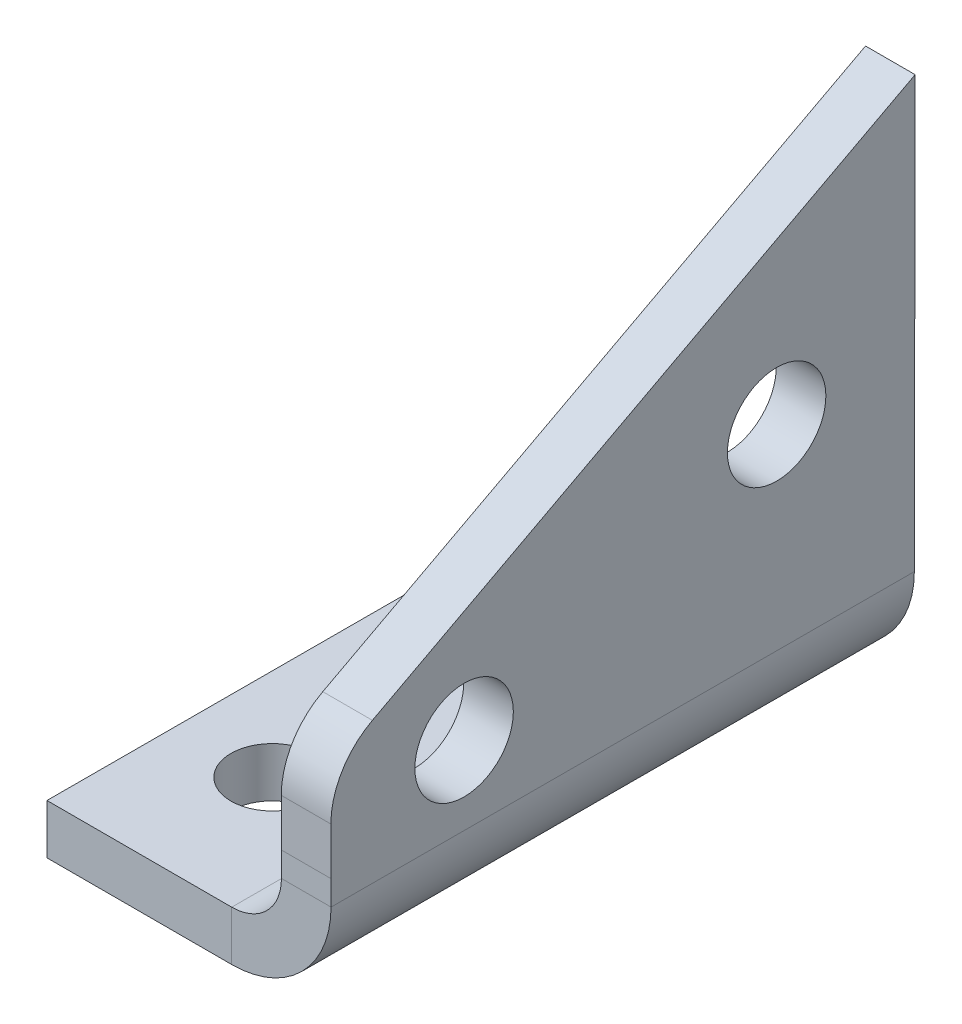
ISO-10303-21;
HEADER;
FILE_DESCRIPTION(('STEP AP214'),'2;1');
FILE_NAME('part.step','',(''),(''),'','','');
FILE_SCHEMA(('AUTOMOTIVE_DESIGN { 1 0 10303 214 1 1 1 1 }'));
ENDSEC;
DATA;
#1=APPLICATION_CONTEXT('core data for automotive mechanical design processes');
#2=APPLICATION_PROTOCOL_DEFINITION('international standard','automotive_design',2000,#1);
#3=PRODUCT_CONTEXT('',#1,'mechanical');
#4=PRODUCT('Part','Part','',(#3));
#5=PRODUCT_RELATED_PRODUCT_CATEGORY('part','',(#4));
#6=PRODUCT_DEFINITION_FORMATION('','',#4);
#7=PRODUCT_DEFINITION_CONTEXT('part definition',#1,'design');
#8=PRODUCT_DEFINITION('design','',#6,#7);
#9=PRODUCT_DEFINITION_SHAPE('','',#8);
#10=(LENGTH_UNIT() NAMED_UNIT(*) SI_UNIT(.MILLI.,.METRE.));
#11=(NAMED_UNIT(*) PLANE_ANGLE_UNIT() SI_UNIT($,.RADIAN.));
#12=(NAMED_UNIT(*) SI_UNIT($,.STERADIAN.) SOLID_ANGLE_UNIT());
#13=UNCERTAINTY_MEASURE_WITH_UNIT(LENGTH_MEASURE(1.E-05),#10,'distance_accuracy_value','');
#14=(GEOMETRIC_REPRESENTATION_CONTEXT(3) GLOBAL_UNCERTAINTY_ASSIGNED_CONTEXT((#13)) GLOBAL_UNIT_ASSIGNED_CONTEXT((#10,
#11,#12)) REPRESENTATION_CONTEXT('',''));
#15=CARTESIAN_POINT('',(0.,0.,0.));
#16=DIRECTION('',(0.,0.,1.));
#17=DIRECTION('',(1.,0.,0.));
#18=AXIS2_PLACEMENT_3D('',#15,#16,#17);
#19=CARTESIAN_POINT('',(-3.175,43.1361689249742,-45.7802099047139));
#20=DIRECTION('',(0.,0.,1.));
#21=DIRECTION('',(1.,0.,0.));
#22=AXIS2_PLACEMENT_3D('',#19,#20,#21);
#23=PLANE('',#22);
#24=DIRECTION('',(0.,-1.,0.));
#25=VECTOR('',#24,1.);
#26=CARTESIAN_POINT('',(-3.175,43.1361689249742,-45.7802099047139));
#27=LINE('',#26,#25);
#28=CARTESIAN_POINT('',(-3.175,43.1361689249742,-45.7802099047139));
#29=VERTEX_POINT('',#28);
#30=CARTESIAN_POINT('',(-3.17500000000001,40.112120038424,-45.7802099047139));
#31=VERTEX_POINT('',#30);
#32=EDGE_CURVE('E232',#29,#31,#27,.T.);
#33=ORIENTED_EDGE('',*,*,#32,.T.);
#34=DIRECTION('',(1.,0.,0.));
#35=VECTOR('',#34,1.);
#36=CARTESIAN_POINT('',(-3.175,40.112120038424,-45.7802099047139));
#37=LINE('',#36,#35);
#38=CARTESIAN_POINT('',(0.,40.112120038424,-45.7802099047139));
#39=VERTEX_POINT('',#38);
#40=EDGE_CURVE('E223',#31,#39,#37,.T.);
#41=ORIENTED_EDGE('',*,*,#40,.T.);
#42=DIRECTION('',(0.,-1.,0.));
#43=VECTOR('',#42,1.);
#44=CARTESIAN_POINT('',(0.,43.1361689249742,-45.7802099047139));
#45=LINE('',#44,#43);
#46=CARTESIAN_POINT('',(0.,43.1361689249742,-45.7802099047139));
#47=VERTEX_POINT('',#46);
#48=EDGE_CURVE('E231',#47,#39,#45,.T.);
#49=ORIENTED_EDGE('',*,*,#48,.F.);
#50=DIRECTION('',(1.,0.,0.));
#51=VECTOR('',#50,1.);
#52=CARTESIAN_POINT('',(-3.175,43.1361689249742,-45.7802099047139));
#53=LINE('',#52,#51);
#54=EDGE_CURVE('E88',#29,#47,#53,.T.);
#55=ORIENTED_EDGE('',*,*,#54,.F.);
#56=EDGE_LOOP('',(#33,#41,#49,#55));
#57=FACE_BOUND('',#56,.T.);
#58=ADVANCED_FACE('F63',(#57),#23,.T.);
#59=CARTESIAN_POINT('',(-3.175,43.1361689249742,-50.7802099047139));
#60=DIRECTION('',(1.,0.,0.));
#61=DIRECTION('',(0.,0.,-1.));
#62=AXIS2_PLACEMENT_3D('',#59,#60,#61);
#63=PLANE('',#62);
#64=CARTESIAN_POINT('',(-3.175,51.0245952416517,-74.3064054804309));
#65=DIRECTION('',(-1.,0.,0.));
#66=DIRECTION('',(0.,0.,1.));
#67=AXIS2_PLACEMENT_3D('',#64,#65,#66);
#68=CIRCLE('',#67,3.15);
#69=CARTESIAN_POINT('',(-3.175,51.0245952416517,-71.1564054804309));
#70=VERTEX_POINT('',#69);
#71=EDGE_CURVE('E258',#70,#70,#68,.T.);
#72=ORIENTED_EDGE('',*,*,#71,.F.);
#73=EDGE_LOOP('',(#72));
#74=FACE_BOUND('',#73,.T.);
#75=CARTESIAN_POINT('',(-3.175,43.5245952416517,-54.3064406141695));
#76=DIRECTION('',(-1.,0.,0.));
#77=DIRECTION('',(0.,0.,1.));
#78=AXIS2_PLACEMENT_3D('',#75,#76,#77);
#79=CIRCLE('',#78,3.15);
#80=CARTESIAN_POINT('',(-3.175,43.5245952416517,-51.1564406141695));
#81=VERTEX_POINT('',#80);
#82=EDGE_CURVE('E264',#81,#81,#79,.T.);
#83=ORIENTED_EDGE('',*,*,#82,.F.);
#84=EDGE_LOOP('',(#83));
#85=FACE_BOUND('',#84,.T.);
#86=DIRECTION('',(0.,-0.00186309094520764,-0.999998264444559));
#87=VECTOR('',#86,1.);
#88=CARTESIAN_POINT('',(-3.17500000000001,40.115050143333,-44.2075009442857));
#89=LINE('',#88,#87);
#90=CARTESIAN_POINT('',(-3.17500000000001,40.1120924864575,-45.7949981890914));
#91=VERTEX_POINT('',#90);
#92=EDGE_CURVE('E221',#31,#91,#89,.T.);
#93=ORIENTED_EDGE('',*,*,#92,.F.);
#94=ORIENTED_EDGE('',*,*,#32,.F.);
#95=CARTESIAN_POINT('',(-3.175,43.1361689249742,-50.7802099047139));
#96=DIRECTION('',(1.,0.,0.));
#97=DIRECTION('',(0.,0.,-1.));
#98=AXIS2_PLACEMENT_3D('',#95,#96,#97);
#99=CIRCLE('',#98,5.);
#100=CARTESIAN_POINT('',(-3.175,47.5535614060292,-48.4378513351692));
#101=VERTEX_POINT('',#100);
#102=EDGE_CURVE('E239',#101,#29,#99,.T.);
#103=ORIENTED_EDGE('',*,*,#102,.F.);
#104=DIRECTION('',(0.,-0.468471713908932,0.883478496210987));
#105=VECTOR('',#104,1.);
#106=CARTESIAN_POINT('',(-3.175,65.9701629409507,-83.1692362754184));
#107=LINE('',#106,#105);
#108=CARTESIAN_POINT('',(-3.175,65.9701629409507,-83.1692362754184));
#109=VERTEX_POINT('',#108);
#110=EDGE_CURVE('E236',#109,#101,#107,.T.);
#111=ORIENTED_EDGE('',*,*,#110,.F.);
#112=DIRECTION('',(0.,0.999998264444559,-0.00186309094520672));
#113=VECTOR('',#112,1.);
#114=CARTESIAN_POINT('',(-3.175,32.1050645348675,-83.1061424077165));
#115=LINE('',#114,#113);
#116=CARTESIAN_POINT('',(-3.17500000000001,38.4550535140904,-83.1179730352186));
#117=VERTEX_POINT('',#116);
#118=EDGE_CURVE('E110',#117,#109,#115,.T.);
#119=ORIENTED_EDGE('',*,*,#118,.F.);
#120=DIRECTION('',(0.,0.0018630909452073,0.999998264444559));
#121=VECTOR('',#120,1.);
#122=CARTESIAN_POINT('',(-3.17500000000001,38.5245952416517,-45.7920405322159));
#123=LINE('',#122,#121);
#124=CARTESIAN_POINT('',(-3.17500000000001,38.5245952416517,-45.7920405322159));
#125=VERTEX_POINT('',#124);
#126=EDGE_CURVE('E211',#125,#117,#123,.F.);
#127=ORIENTED_EDGE('',*,*,#126,.F.);
#128=DIRECTION('',(0.,-0.999998264444559,0.00186309094520764));
#129=VECTOR('',#128,1.);
#130=CARTESIAN_POINT('',(-3.17500000000001,40.1120924864575,-45.7949981890914));
#131=LINE('',#130,#129);
#132=EDGE_CURVE('E224',#91,#125,#131,.T.);
#133=ORIENTED_EDGE('',*,*,#132,.F.);
#134=EDGE_LOOP('',(#93,#94,#103,#111,#119,#127,#133));
#135=FACE_BOUND('',#134,.T.);
#136=ADVANCED_FACE('F306',(#74,#85,#135),#63,.F.);
#137=CARTESIAN_POINT('',(0.,43.1361689249742,-50.7802099047139));
#138=DIRECTION('',(1.,0.,0.));
#139=DIRECTION('',(0.,0.,-1.));
#140=AXIS2_PLACEMENT_3D('',#137,#138,#139);
#141=PLANE('',#140);
#142=CARTESIAN_POINT('',(0.,51.0245952416517,-74.3064054804309));
#143=DIRECTION('',(1.,0.,0.));
#144=DIRECTION('',(0.,0.,-1.));
#145=AXIS2_PLACEMENT_3D('',#142,#143,#144);
#146=CIRCLE('',#145,3.15);
#147=CARTESIAN_POINT('',(0.,51.0245952416517,-77.4564054804309));
#148=VERTEX_POINT('',#147);
#149=EDGE_CURVE('E66',#148,#148,#146,.T.);
#150=ORIENTED_EDGE('',*,*,#149,.F.);
#151=EDGE_LOOP('',(#150));
#152=FACE_BOUND('',#151,.T.);
#153=CARTESIAN_POINT('',(0.,43.5245952416517,-54.3064406141695));
#154=DIRECTION('',(1.,0.,0.));
#155=DIRECTION('',(0.,0.,-1.));
#156=AXIS2_PLACEMENT_3D('',#153,#154,#155);
#157=CIRCLE('',#156,3.15);
#158=CARTESIAN_POINT('',(0.,43.5245952416517,-57.4564406141695));
#159=VERTEX_POINT('',#158);
#160=EDGE_CURVE('E256',#159,#159,#157,.T.);
#161=ORIENTED_EDGE('',*,*,#160,.F.);
#162=EDGE_LOOP('',(#161));
#163=FACE_BOUND('',#162,.T.);
#164=ORIENTED_EDGE('',*,*,#48,.T.);
#165=DIRECTION('',(0.,-0.00186309094520764,-0.999998264444559));
#166=VECTOR('',#165,1.);
#167=CARTESIAN_POINT('',(0.,40.1028150966653,-50.7745584808544));
#168=LINE('',#167,#166);
#169=CARTESIAN_POINT('',(0.,40.1120924864575,-45.7949981890914));
#170=VERTEX_POINT('',#169);
#171=EDGE_CURVE('E13',#39,#170,#168,.T.);
#172=ORIENTED_EDGE('',*,*,#171,.T.);
#173=DIRECTION('',(0.,-0.999998264444559,0.00186309094520764));
#174=VECTOR('',#173,1.);
#175=CARTESIAN_POINT('',(0.,43.1454463147664,-45.8006496129509));
#176=LINE('',#175,#174);
#177=CARTESIAN_POINT('',(0.,38.5245952416517,-45.7920405322159));
#178=VERTEX_POINT('',#177);
#179=EDGE_CURVE('E71',#170,#178,#176,.T.);
#180=ORIENTED_EDGE('',*,*,#179,.T.);
#181=DIRECTION('',(0.,0.0018630909452073,0.999998264444559));
#182=VECTOR('',#181,1.);
#183=CARTESIAN_POINT('',(0.,38.5245952416517,-45.7920405322159));
#184=LINE('',#183,#182);
#185=CARTESIAN_POINT('',(0.,38.4550535140904,-83.1179730352186));
#186=VERTEX_POINT('',#185);
#187=EDGE_CURVE('E200',#178,#186,#184,.F.);
#188=ORIENTED_EDGE('',*,*,#187,.T.);
#189=DIRECTION('',(0.,0.999998264444559,-0.00186309094520672));
#190=VECTOR('',#189,1.);
#191=CARTESIAN_POINT('',(0.,32.1050645348675,-83.1061424077165));
#192=LINE('',#191,#190);
#193=CARTESIAN_POINT('',(0.,65.9701629409507,-83.1692362754184));
#194=VERTEX_POINT('',#193);
#195=EDGE_CURVE('E244',#186,#194,#192,.T.);
#196=ORIENTED_EDGE('',*,*,#195,.T.);
#197=DIRECTION('',(0.,-0.468471713908932,0.883478496210987));
#198=VECTOR('',#197,1.);
#199=CARTESIAN_POINT('',(0.,65.9701629409507,-83.1692362754184));
#200=LINE('',#199,#198);
#201=CARTESIAN_POINT('',(0.,47.5535614060292,-48.4378513351692));
#202=VERTEX_POINT('',#201);
#203=EDGE_CURVE('E246',#194,#202,#200,.T.);
#204=ORIENTED_EDGE('',*,*,#203,.T.);
#205=CARTESIAN_POINT('',(0.,43.1361689249742,-50.7802099047139));
#206=DIRECTION('',(1.,0.,0.));
#207=DIRECTION('',(0.,0.,-1.));
#208=AXIS2_PLACEMENT_3D('',#205,#206,#207);
#209=CIRCLE('',#208,5.);
#210=EDGE_CURVE('E234',#202,#47,#209,.T.);
#211=ORIENTED_EDGE('',*,*,#210,.T.);
#212=EDGE_LOOP('',(#164,#172,#180,#188,#196,#204,#211));
#213=FACE_BOUND('',#212,.T.);
#214=ADVANCED_FACE('F299',(#152,#163,#213),#141,.T.);
#215=CARTESIAN_POINT('',(-3.175,43.1361689249742,-50.7802099047139));
#216=DIRECTION('',(1.,0.,0.));
#217=DIRECTION('',(0.,0.,-1.));
#218=AXIS2_PLACEMENT_3D('',#215,#216,#217);
#219=CYLINDRICAL_SURFACE('',#218,5.);
#220=ORIENTED_EDGE('',*,*,#210,.F.);
#221=DIRECTION('',(1.,0.,0.));
#222=VECTOR('',#221,1.);
#223=CARTESIAN_POINT('',(-3.175,47.5535614060292,-48.4378513351692));
#224=LINE('',#223,#222);
#225=EDGE_CURVE('E252',#101,#202,#224,.T.);
#226=ORIENTED_EDGE('',*,*,#225,.F.);
#227=ORIENTED_EDGE('',*,*,#102,.T.);
#228=ORIENTED_EDGE('',*,*,#54,.T.);
#229=EDGE_LOOP('',(#220,#226,#227,#228));
#230=FACE_BOUND('',#229,.T.);
#231=ADVANCED_FACE('F308',(#230),#219,.T.);
#232=CARTESIAN_POINT('',(-3.175,65.9701629409507,-83.1692362754184));
#233=DIRECTION('',(0.,0.883478496210987,0.468471713908932));
#234=DIRECTION('',(0.,-0.468471713908932,0.883478496210988));
#235=AXIS2_PLACEMENT_3D('',#232,#233,#234);
#236=PLANE('',#235);
#237=ORIENTED_EDGE('',*,*,#203,.F.);
#238=DIRECTION('',(1.,0.,0.));
#239=VECTOR('',#238,1.);
#240=CARTESIAN_POINT('',(-3.175,65.9701629409507,-83.1692362754184));
#241=LINE('',#240,#239);
#242=EDGE_CURVE('E241',#109,#194,#241,.T.);
#243=ORIENTED_EDGE('',*,*,#242,.F.);
#244=ORIENTED_EDGE('',*,*,#110,.T.);
#245=ORIENTED_EDGE('',*,*,#225,.T.);
#246=EDGE_LOOP('',(#237,#243,#244,#245));
#247=FACE_BOUND('',#246,.T.);
#248=ADVANCED_FACE('F311',(#247),#236,.T.);
#249=CARTESIAN_POINT('',(-3.175,32.1050645348675,-83.1061424077165));
#250=DIRECTION('',(0.,-0.00186309094520672,-0.999998264444559));
#251=DIRECTION('',(0.,0.999998264444559,-0.00186309094520672));
#252=AXIS2_PLACEMENT_3D('',#249,#250,#251);
#253=PLANE('',#252);
#254=DIRECTION('',(1.,0.,0.));
#255=VECTOR('',#254,1.);
#256=CARTESIAN_POINT('',(-3.17500000000001,38.4550535140904,-83.1179730352186));
#257=LINE('',#256,#255);
#258=EDGE_CURVE('E216',#117,#186,#257,.T.);
#259=ORIENTED_EDGE('',*,*,#258,.F.);
#260=ORIENTED_EDGE('',*,*,#118,.T.);
#261=ORIENTED_EDGE('',*,*,#242,.T.);
#262=ORIENTED_EDGE('',*,*,#195,.F.);
#263=EDGE_LOOP('',(#259,#260,#261,#262));
#264=FACE_BOUND('',#263,.T.);
#265=ADVANCED_FACE('F314',(#264),#253,.T.);
#266=CARTESIAN_POINT('',(-3.17500000000001,40.115050143333,-44.2075009442857));
#267=DIRECTION('',(0.,-0.999998264444559,0.00186309094520764));
#268=DIRECTION('',(0.,-0.00186309094520764,-0.999998264444559));
#269=AXIS2_PLACEMENT_3D('',#266,#267,#268);
#270=PLANE('',#269);
#271=ORIENTED_EDGE('',*,*,#40,.F.);
#272=ORIENTED_EDGE('',*,*,#92,.T.);
#273=DIRECTION('',(1.,0.,0.));
#274=VECTOR('',#273,1.);
#275=CARTESIAN_POINT('',(-3.17500000000001,40.1120924864575,-45.7949981890914));
#276=LINE('',#275,#274);
#277=EDGE_CURVE('E218',#91,#170,#276,.T.);
#278=ORIENTED_EDGE('',*,*,#277,.T.);
#279=ORIENTED_EDGE('',*,*,#171,.F.);
#280=EDGE_LOOP('',(#271,#272,#278,#279));
#281=FACE_BOUND('',#280,.T.);
#282=ADVANCED_FACE('F302',(#281),#270,.T.);
#283=CARTESIAN_POINT('',(-3.17500000000001,40.1120924864575,-45.7949981890914));
#284=DIRECTION('',(0.,0.00186309094520764,0.999998264444559));
#285=DIRECTION('',(0.,-0.999998264444559,0.00186309094520764));
#286=AXIS2_PLACEMENT_3D('',#283,#284,#285);
#287=PLANE('',#286);
#288=ORIENTED_EDGE('',*,*,#179,.F.);
#289=ORIENTED_EDGE('',*,*,#277,.F.);
#290=ORIENTED_EDGE('',*,*,#132,.T.);
#291=DIRECTION('',(1.,0.,0.));
#292=VECTOR('',#291,1.);
#293=CARTESIAN_POINT('',(-3.17500000000001,38.5245952416517,-45.7920405322159));
#294=LINE('',#293,#292);
#295=EDGE_CURVE('E205',#125,#178,#294,.T.);
#296=ORIENTED_EDGE('',*,*,#295,.T.);
#297=EDGE_LOOP('',(#288,#289,#290,#296));
#298=FACE_BOUND('',#297,.T.);
#299=ADVANCED_FACE('F294',(#298),#287,.T.);
#300=CARTESIAN_POINT('',(-6.35,38.4550535140904,-83.1179730352186));
#301=DIRECTION('',(0.,-0.0018630909452073,-0.999998264444559));
#302=DIRECTION('',(0.,0.999998264444559,-0.0018630909452073));
#303=AXIS2_PLACEMENT_3D('',#300,#301,#302);
#304=PLANE('',#303);
#305=DIRECTION('',(0.,0.999998264444559,-0.0018630909452066));
#306=VECTOR('',#305,1.);
#307=CARTESIAN_POINT('',(-6.34999999999998,32.1050645348675,-83.1061424077165));
#308=LINE('',#307,#306);
#309=CARTESIAN_POINT('',(-6.34999999999999,35.280059024479,-83.1120577214676));
#310=VERTEX_POINT('',#309);
#311=CARTESIAN_POINT('',(-6.34999999999998,32.1050645348675,-83.1061424077165));
#312=VERTEX_POINT('',#311);
#313=EDGE_CURVE('E181',#310,#312,#308,.F.);
#314=ORIENTED_EDGE('',*,*,#313,.F.);
#315=CARTESIAN_POINT('',(-6.35,38.4550535140904,-83.1179730352186));
#316=DIRECTION('',(0.,0.0018630909452073,0.999998264444559));
#317=DIRECTION('',(0.,-0.999998264444559,0.0018630909452073));
#318=AXIS2_PLACEMENT_3D('',#315,#316,#317);
#319=CIRCLE('',#318,3.175);
#320=EDGE_CURVE('E208',#117,#310,#319,.F.);
#321=ORIENTED_EDGE('',*,*,#320,.F.);
#322=ORIENTED_EDGE('',*,*,#258,.T.);
#323=CARTESIAN_POINT('',(-6.35,38.4550535140904,-83.1179730352186));
#324=DIRECTION('',(0.,0.0018630909452073,0.999998264444559));
#325=DIRECTION('',(0.,-0.999998264444559,0.0018630909452073));
#326=AXIS2_PLACEMENT_3D('',#323,#324,#325);
#327=CIRCLE('',#326,6.35);
#328=EDGE_CURVE('E79',#186,#312,#327,.F.);
#329=ORIENTED_EDGE('',*,*,#328,.T.);
#330=EDGE_LOOP('',(#314,#321,#322,#329));
#331=FACE_BOUND('',#330,.T.);
#332=ADVANCED_FACE('F313',(#331),#304,.T.);
#333=CARTESIAN_POINT('',(-6.35,38.5245952416517,-45.7920405322159));
#334=DIRECTION('',(0.,-0.0018630909452073,-0.999998264444559));
#335=DIRECTION('',(0.,0.999998264444559,-0.0018630909452073));
#336=AXIS2_PLACEMENT_3D('',#333,#334,#335);
#337=PLANE('',#336);
#338=CARTESIAN_POINT('',(-6.35,38.5245952416517,-45.7920405322159));
#339=DIRECTION('',(0.,0.0018630909452073,0.999998264444559));
#340=DIRECTION('',(0.,-0.999998264444559,0.0018630909452073));
#341=AXIS2_PLACEMENT_3D('',#338,#339,#340);
#342=CIRCLE('',#341,3.175);
#343=CARTESIAN_POINT('',(-6.34999999999999,35.3496007520403,-45.7861252184649));
#344=VERTEX_POINT('',#343);
#345=EDGE_CURVE('E213',#344,#125,#342,.T.);
#346=ORIENTED_EDGE('',*,*,#345,.F.);
#347=DIRECTION('',(0.,0.999998264444559,-0.0018630909452066));
#348=VECTOR('',#347,1.);
#349=CARTESIAN_POINT('',(-6.34999999999999,35.3496007520402,-45.7861252184649));
#350=LINE('',#349,#348);
#351=CARTESIAN_POINT('',(-6.34999999999998,32.1746062624288,-45.7802099047139));
#352=VERTEX_POINT('',#351);
#353=EDGE_CURVE('E193',#344,#352,#350,.F.);
#354=ORIENTED_EDGE('',*,*,#353,.T.);
#355=CARTESIAN_POINT('',(-6.35,38.5245952416517,-45.7920405322159));
#356=DIRECTION('',(0.,0.0018630909452073,0.999998264444559));
#357=DIRECTION('',(0.,-0.999998264444559,0.0018630909452073));
#358=AXIS2_PLACEMENT_3D('',#355,#356,#357);
#359=CIRCLE('',#358,6.35);
#360=EDGE_CURVE('E203',#352,#178,#359,.T.);
#361=ORIENTED_EDGE('',*,*,#360,.T.);
#362=ORIENTED_EDGE('',*,*,#295,.F.);
#363=EDGE_LOOP('',(#346,#354,#361,#362));
#364=FACE_BOUND('',#363,.T.);
#365=ADVANCED_FACE('F292',(#364),#337,.F.);
#366=CARTESIAN_POINT('',(-6.35,38.5245952416517,-45.7920405322159));
#367=DIRECTION('',(0.,0.0018630909452073,0.999998264444559));
#368=DIRECTION('',(0.,-0.999998264444559,0.0018630909452073));
#369=AXIS2_PLACEMENT_3D('',#366,#367,#368);
#370=CYLINDRICAL_SURFACE('',#369,6.35);
#371=ORIENTED_EDGE('',*,*,#187,.F.);
#372=ORIENTED_EDGE('',*,*,#360,.F.);
#373=DIRECTION('',(0.,0.0018630909452066,0.999998264444559));
#374=VECTOR('',#373,1.);
#375=CARTESIAN_POINT('',(-6.34999999999998,32.1050645348675,-83.1061424077165));
#376=LINE('',#375,#374);
#377=EDGE_CURVE('E191',#352,#312,#376,.F.);
#378=ORIENTED_EDGE('',*,*,#377,.T.);
#379=ORIENTED_EDGE('',*,*,#328,.F.);
#380=EDGE_LOOP('',(#371,#372,#378,#379));
#381=FACE_BOUND('',#380,.T.);
#382=ADVANCED_FACE('F401',(#381),#370,.T.);
#383=CARTESIAN_POINT('',(-6.35,38.5245952416517,-45.7920405322159));
#384=DIRECTION('',(0.,0.0018630909452073,0.999998264444559));
#385=DIRECTION('',(0.,-0.999998264444559,0.0018630909452073));
#386=AXIS2_PLACEMENT_3D('',#383,#384,#385);
#387=CYLINDRICAL_SURFACE('',#386,3.175);
#388=ORIENTED_EDGE('',*,*,#126,.T.);
#389=ORIENTED_EDGE('',*,*,#320,.T.);
#390=DIRECTION('',(0.,0.0018630909452066,0.999998264444559));
#391=VECTOR('',#390,1.);
#392=CARTESIAN_POINT('',(-6.34999999999999,35.280059024479,-83.1120577214676));
#393=LINE('',#392,#391);
#394=EDGE_CURVE('E196',#310,#344,#393,.T.);
#395=ORIENTED_EDGE('',*,*,#394,.T.);
#396=ORIENTED_EDGE('',*,*,#345,.T.);
#397=EDGE_LOOP('',(#388,#389,#395,#396));
#398=FACE_BOUND('',#397,.T.);
#399=ADVANCED_FACE('F289',(#398),#387,.F.);
#400=CARTESIAN_POINT('',(-18.175,32.1746062624287,-45.7802099047138));
#401=DIRECTION('',(0.,-0.0018630909452066,-0.999998264444559));
#402=DIRECTION('',(0.,0.999998264444559,-0.0018630909452066));
#403=AXIS2_PLACEMENT_3D('',#400,#401,#402);
#404=PLANE('',#403);
#405=ORIENTED_EDGE('',*,*,#353,.F.);
#406=DIRECTION('',(1.,0.,0.));
#407=VECTOR('',#406,1.);
#408=CARTESIAN_POINT('',(-18.175,35.3496007520402,-45.7861252184649));
#409=LINE('',#408,#407);
#410=CARTESIAN_POINT('',(-18.175,35.3496007520402,-45.7861252184649));
#411=VERTEX_POINT('',#410);
#412=EDGE_CURVE('E189',#344,#411,#409,.F.);
#413=ORIENTED_EDGE('',*,*,#412,.T.);
#414=DIRECTION('',(0.,0.999998264444559,-0.0018630909452066));
#415=VECTOR('',#414,1.);
#416=CARTESIAN_POINT('',(-18.175,32.1746062624287,-45.7802099047138));
#417=LINE('',#416,#415);
#418=CARTESIAN_POINT('',(-18.175,32.1746062624287,-45.7802099047139));
#419=VERTEX_POINT('',#418);
#420=EDGE_CURVE('E177',#419,#411,#417,.T.);
#421=ORIENTED_EDGE('',*,*,#420,.F.);
#422=DIRECTION('',(-1.,0.,0.));
#423=VECTOR('',#422,1.);
#424=CARTESIAN_POINT('',(-1.35455966325153E-13,32.1746062624288,-45.7802099047139));
#425=LINE('',#424,#423);
#426=EDGE_CURVE('E164',#352,#419,#425,.T.);
#427=ORIENTED_EDGE('',*,*,#426,.F.);
#428=EDGE_LOOP('',(#405,#413,#421,#427));
#429=FACE_BOUND('',#428,.T.);
#430=ADVANCED_FACE('F282',(#429),#404,.F.);
#431=CARTESIAN_POINT('',(-3.17499999999999,32.1050645348675,-83.1061424077165));
#432=DIRECTION('',(0.,0.0018630909452066,0.999998264444559));
#433=DIRECTION('',(0.,-0.999998264444559,0.0018630909452066));
#434=AXIS2_PLACEMENT_3D('',#431,#432,#433);
#435=PLANE('',#434);
#436=ORIENTED_EDGE('',*,*,#313,.T.);
#437=DIRECTION('',(1.,0.,0.));
#438=VECTOR('',#437,1.);
#439=CARTESIAN_POINT('',(0.,32.1050645348675,-83.1061424077165));
#440=LINE('',#439,#438);
#441=CARTESIAN_POINT('',(-18.175,32.1050645348675,-83.1061424077165));
#442=VERTEX_POINT('',#441);
#443=EDGE_CURVE('E162',#442,#312,#440,.T.);
#444=ORIENTED_EDGE('',*,*,#443,.F.);
#445=DIRECTION('',(0.,0.999998264444559,-0.0018630909452066));
#446=VECTOR('',#445,1.);
#447=CARTESIAN_POINT('',(-18.175,32.1050645348675,-83.1061424077165));
#448=LINE('',#447,#446);
#449=CARTESIAN_POINT('',(-18.175,35.2800590244789,-83.1120577214676));
#450=VERTEX_POINT('',#449);
#451=EDGE_CURVE('E170',#442,#450,#448,.T.);
#452=ORIENTED_EDGE('',*,*,#451,.T.);
#453=DIRECTION('',(-1.,0.,0.));
#454=VECTOR('',#453,1.);
#455=CARTESIAN_POINT('',(-3.175,35.280059024479,-83.1120577214676));
#456=LINE('',#455,#454);
#457=EDGE_CURVE('E186',#450,#310,#456,.F.);
#458=ORIENTED_EDGE('',*,*,#457,.T.);
#459=EDGE_LOOP('',(#436,#444,#452,#458));
#460=FACE_BOUND('',#459,.T.);
#461=ADVANCED_FACE('F180',(#460),#435,.F.);
#462=CARTESIAN_POINT('',(0.,32.2597871274127,-0.0601030216035012));
#463=DIRECTION('',(0.,0.999998264444559,-0.0018630909452066));
#464=DIRECTION('',(0.,0.0018630909452066,0.999998264444559));
#465=AXIS2_PLACEMENT_3D('',#462,#463,#464);
#466=PLANE('',#465);
#467=CARTESIAN_POINT('',(-12.2625,32.1214835878806,-74.2933549486774));
#468=DIRECTION('',(0.,0.999998264444559,-0.0018630909452066));
#469=DIRECTION('',(0.,0.0018630909452066,0.999998264444559));
#470=AXIS2_PLACEMENT_3D('',#467,#468,#469);
#471=CIRCLE('',#470,2.65);
#472=CARTESIAN_POINT('',(-12.2625,32.1264207788854,-71.6433595478993));
#473=VERTEX_POINT('',#472);
#474=EDGE_CURVE('E199',#473,#473,#471,.T.);
#475=ORIENTED_EDGE('',*,*,#474,.T.);
#476=EDGE_LOOP('',(#475));
#477=FACE_BOUND('',#476,.T.);
#478=CARTESIAN_POINT('',(-12.2625,32.1587454075722,-54.2933892371565));
#479=DIRECTION('',(0.,0.999998264444559,-0.0018630909452066));
#480=DIRECTION('',(0.,0.0018630909452066,0.999998264444559));
#481=AXIS2_PLACEMENT_3D('',#478,#479,#480);
#482=CIRCLE('',#481,2.65);
#483=CARTESIAN_POINT('',(-12.2625,32.163682598577,-51.6433938363784));
#484=VERTEX_POINT('',#483);
#485=EDGE_CURVE('E274',#484,#484,#482,.T.);
#486=ORIENTED_EDGE('',*,*,#485,.T.);
#487=EDGE_LOOP('',(#486));
#488=FACE_BOUND('',#487,.T.);
#489=ORIENTED_EDGE('',*,*,#377,.F.);
#490=ORIENTED_EDGE('',*,*,#426,.T.);
#491=DIRECTION('',(0.,-0.0018630909452066,-0.999998264444559));
#492=VECTOR('',#491,1.);
#493=CARTESIAN_POINT('',(-18.175,32.2597871274126,-0.0601030216035011));
#494=LINE('',#493,#492);
#495=EDGE_CURVE('E157',#419,#442,#494,.T.);
#496=ORIENTED_EDGE('',*,*,#495,.T.);
#497=ORIENTED_EDGE('',*,*,#443,.T.);
#498=EDGE_LOOP('',(#489,#490,#496,#497));
#499=FACE_BOUND('',#498,.T.);
#500=ADVANCED_FACE('F160',(#477,#488,#499),#466,.F.);
#501=CARTESIAN_POINT('',(-1.04517651910578E-13,35.4347816170242,-0.0660183353545321));
#502=DIRECTION('',(0.,0.999998264444559,-0.0018630909452066));
#503=DIRECTION('',(0.,0.0018630909452066,0.999998264444559));
#504=AXIS2_PLACEMENT_3D('',#501,#502,#503);
#505=PLANE('',#504);
#506=CARTESIAN_POINT('',(-12.2625,35.2964780774921,-74.2992702624284));
#507=DIRECTION('',(0.,0.999998264444559,-0.0018630909452066));
#508=DIRECTION('',(0.,0.0018630909452066,0.999998264444559));
#509=AXIS2_PLACEMENT_3D('',#506,#507,#508);
#510=CIRCLE('',#509,2.65);
#511=CARTESIAN_POINT('',(-12.2625,35.3014152684969,-71.6492748616503));
#512=VERTEX_POINT('',#511);
#513=EDGE_CURVE('E271',#512,#512,#510,.T.);
#514=ORIENTED_EDGE('',*,*,#513,.F.);
#515=EDGE_LOOP('',(#514));
#516=FACE_BOUND('',#515,.T.);
#517=CARTESIAN_POINT('',(-12.2625,35.3337398971836,-54.2993045509076));
#518=DIRECTION('',(0.,0.999998264444559,-0.0018630909452066));
#519=DIRECTION('',(0.,0.0018630909452066,0.999998264444559));
#520=AXIS2_PLACEMENT_3D('',#517,#518,#519);
#521=CIRCLE('',#520,2.65);
#522=CARTESIAN_POINT('',(-12.2625,35.3386770881884,-51.6493091501295));
#523=VERTEX_POINT('',#522);
#524=EDGE_CURVE('E262',#523,#523,#521,.T.);
#525=ORIENTED_EDGE('',*,*,#524,.F.);
#526=EDGE_LOOP('',(#525));
#527=FACE_BOUND('',#526,.T.);
#528=ORIENTED_EDGE('',*,*,#412,.F.);
#529=ORIENTED_EDGE('',*,*,#394,.F.);
#530=ORIENTED_EDGE('',*,*,#457,.F.);
#531=DIRECTION('',(0.,0.0018630909452066,0.999998264444559));
#532=VECTOR('',#531,1.);
#533=CARTESIAN_POINT('',(-18.175,35.2800590244789,-83.1120577214676));
#534=LINE('',#533,#532);
#535=EDGE_CURVE('E173',#411,#450,#534,.F.);
#536=ORIENTED_EDGE('',*,*,#535,.F.);
#537=EDGE_LOOP('',(#528,#529,#530,#536));
#538=FACE_BOUND('',#537,.T.);
#539=ADVANCED_FACE('F286',(#516,#527,#538),#505,.T.);
#540=CARTESIAN_POINT('',(-18.175,32.1050645348675,-83.1061424077165));
#541=DIRECTION('',(1.,0.,0.));
#542=DIRECTION('',(0.,1.,0.));
#543=AXIS2_PLACEMENT_3D('',#540,#541,#542);
#544=PLANE('',#543);
#545=ORIENTED_EDGE('',*,*,#535,.T.);
#546=ORIENTED_EDGE('',*,*,#451,.F.);
#547=ORIENTED_EDGE('',*,*,#495,.F.);
#548=ORIENTED_EDGE('',*,*,#420,.T.);
#549=EDGE_LOOP('',(#545,#546,#547,#548));
#550=FACE_BOUND('',#549,.T.);
#551=ADVANCED_FACE('F171',(#550),#544,.F.);
#552=CARTESIAN_POINT('',(-12.2624999999999,25.333757252738,-54.2806736414555));
#553=DIRECTION('',(0.,0.999998264444559,-0.0018630909452066));
#554=DIRECTION('',(0.,0.0018630909452066,0.999998264444559));
#555=AXIS2_PLACEMENT_3D('',#552,#553,#554);
#556=CYLINDRICAL_SURFACE('',#555,2.65);
#557=ORIENTED_EDGE('',*,*,#524,.T.);
#558=EDGE_LOOP('',(#557));
#559=FACE_BOUND('',#558,.T.);
#560=ORIENTED_EDGE('',*,*,#485,.F.);
#561=EDGE_LOOP('',(#560));
#562=FACE_BOUND('',#561,.T.);
#563=ADVANCED_FACE('F468',(#559,#562),#556,.F.);
#564=CARTESIAN_POINT('',(-12.2625,25.2964954330465,-74.2806393529764));
#565=DIRECTION('',(0.,0.999998264444559,-0.0018630909452066));
#566=DIRECTION('',(0.,0.0018630909452066,0.999998264444559));
#567=AXIS2_PLACEMENT_3D('',#564,#565,#566);
#568=CYLINDRICAL_SURFACE('',#567,2.65);
#569=ORIENTED_EDGE('',*,*,#513,.T.);
#570=EDGE_LOOP('',(#569));
#571=FACE_BOUND('',#570,.T.);
#572=ORIENTED_EDGE('',*,*,#474,.F.);
#573=EDGE_LOOP('',(#572));
#574=FACE_BOUND('',#573,.T.);
#575=ADVANCED_FACE('F477',(#571,#574),#568,.F.);
#576=CARTESIAN_POINT('',(6.825,43.5245952416517,-54.3064406141695));
#577=DIRECTION('',(-1.,0.,0.));
#578=DIRECTION('',(0.,0.,1.));
#579=AXIS2_PLACEMENT_3D('',#576,#577,#578);
#580=CYLINDRICAL_SURFACE('',#579,3.15);
#581=ORIENTED_EDGE('',*,*,#160,.T.);
#582=EDGE_LOOP('',(#581));
#583=FACE_BOUND('',#582,.T.);
#584=ORIENTED_EDGE('',*,*,#82,.T.);
#585=EDGE_LOOP('',(#584));
#586=FACE_BOUND('',#585,.T.);
#587=ADVANCED_FACE('F487',(#583,#586),#580,.F.);
#588=CARTESIAN_POINT('',(6.825,51.0245952416517,-74.3064054804309));
#589=DIRECTION('',(-1.,0.,0.));
#590=DIRECTION('',(0.,0.,1.));
#591=AXIS2_PLACEMENT_3D('',#588,#589,#590);
#592=CYLINDRICAL_SURFACE('',#591,3.15);
#593=ORIENTED_EDGE('',*,*,#149,.T.);
#594=EDGE_LOOP('',(#593));
#595=FACE_BOUND('',#594,.T.);
#596=ORIENTED_EDGE('',*,*,#71,.T.);
#597=EDGE_LOOP('',(#596));
#598=FACE_BOUND('',#597,.T.);
#599=ADVANCED_FACE('F498',(#595,#598),#592,.F.);
#600=CLOSED_SHELL('',(#58,#136,#214,#231,#248,#265,#282,#299,#332,#365,#382,#399,#430,#461,#500,
#539,#551,#563,#575,#587,#599));
#601=MANIFOLD_SOLID_BREP('B2',#600);
#602=ADVANCED_BREP_SHAPE_REPRESENTATION('',(#18,#601),#14);
#603=SHAPE_DEFINITION_REPRESENTATION(#9,#602);
ENDSEC;
END-ISO-10303-21;
